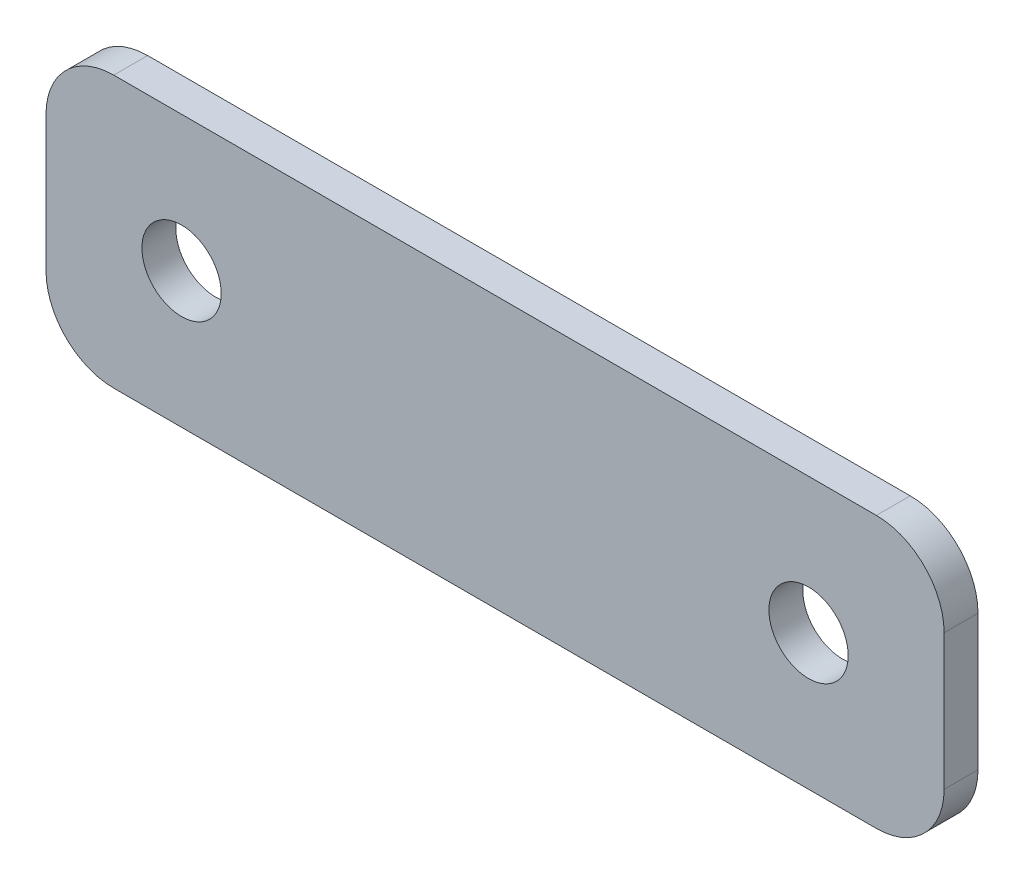
ISO-10303-21;
HEADER;
FILE_DESCRIPTION(('STEP AP214'),'2;1');
FILE_NAME('part.step','',(''),(''),'','','');
FILE_SCHEMA(('AUTOMOTIVE_DESIGN { 1 0 10303 214 1 1 1 1 }'));
ENDSEC;
DATA;
#1=APPLICATION_CONTEXT('core data for automotive mechanical design processes');
#2=APPLICATION_PROTOCOL_DEFINITION('international standard','automotive_design',2000,#1);
#3=PRODUCT_CONTEXT('',#1,'mechanical');
#4=PRODUCT('Part','Part','',(#3));
#5=PRODUCT_RELATED_PRODUCT_CATEGORY('part','',(#4));
#6=PRODUCT_DEFINITION_FORMATION('','',#4);
#7=PRODUCT_DEFINITION_CONTEXT('part definition',#1,'design');
#8=PRODUCT_DEFINITION('design','',#6,#7);
#9=PRODUCT_DEFINITION_SHAPE('','',#8);
#10=(LENGTH_UNIT() NAMED_UNIT(*) SI_UNIT(.MILLI.,.METRE.));
#11=(NAMED_UNIT(*) PLANE_ANGLE_UNIT() SI_UNIT($,.RADIAN.));
#12=(NAMED_UNIT(*) SI_UNIT($,.STERADIAN.) SOLID_ANGLE_UNIT());
#13=UNCERTAINTY_MEASURE_WITH_UNIT(LENGTH_MEASURE(1.E-05),#10,'distance_accuracy_value','');
#14=(GEOMETRIC_REPRESENTATION_CONTEXT(3) GLOBAL_UNCERTAINTY_ASSIGNED_CONTEXT((#13)) GLOBAL_UNIT_ASSIGNED_CONTEXT((#10,
#11,#12)) REPRESENTATION_CONTEXT('',''));
#15=CARTESIAN_POINT('',(0.,0.,0.));
#16=DIRECTION('',(0.,0.,1.));
#17=DIRECTION('',(1.,0.,0.));
#18=AXIS2_PLACEMENT_3D('',#15,#16,#17);
#19=CARTESIAN_POINT('',(5.08,5.08,2.54));
#20=DIRECTION('',(0.,0.,1.));
#21=DIRECTION('',(1.,0.,0.));
#22=AXIS2_PLACEMENT_3D('',#19,#20,#21);
#23=PLANE('',#22);
#24=CARTESIAN_POINT('',(0.,0.,2.54));
#25=DIRECTION('',(0.,0.,1.));
#26=DIRECTION('',(1.,0.,0.));
#27=AXIS2_PLACEMENT_3D('',#24,#25,#26);
#28=CIRCLE('',#27,2.9718);
#29=CARTESIAN_POINT('',(2.9718,0.,2.54));
#30=VERTEX_POINT('',#29);
#31=EDGE_CURVE('E152',#30,#30,#28,.T.);
#32=ORIENTED_EDGE('',*,*,#31,.F.);
#33=EDGE_LOOP('',(#32));
#34=FACE_BOUND('',#33,.T.);
#35=CARTESIAN_POINT('',(5.08,5.08,2.54));
#36=DIRECTION('',(0.,0.,1.));
#37=DIRECTION('',(1.,0.,0.));
#38=AXIS2_PLACEMENT_3D('',#35,#36,#37);
#39=CIRCLE('',#38,5.08);
#40=CARTESIAN_POINT('',(10.16,5.07999999999996,2.54));
#41=VERTEX_POINT('',#40);
#42=CARTESIAN_POINT('',(5.07999999999996,10.16,2.54));
#43=VERTEX_POINT('',#42);
#44=EDGE_CURVE('E172',#41,#43,#39,.T.);
#45=ORIENTED_EDGE('',*,*,#44,.T.);
#46=DIRECTION('',(-1.,0.,0.));
#47=VECTOR('',#46,1.);
#48=CARTESIAN_POINT('',(0.,10.16,2.54));
#49=LINE('',#48,#47);
#50=CARTESIAN_POINT('',(-52.07,10.16,2.54));
#51=VERTEX_POINT('',#50);
#52=EDGE_CURVE('E104',#43,#51,#49,.T.);
#53=ORIENTED_EDGE('',*,*,#52,.T.);
#54=CARTESIAN_POINT('',(-52.07,5.08,2.54));
#55=DIRECTION('',(0.,0.,1.));
#56=DIRECTION('',(-1.,0.,0.));
#57=AXIS2_PLACEMENT_3D('',#54,#55,#56);
#58=CIRCLE('',#57,5.08);
#59=CARTESIAN_POINT('',(-57.15,5.07999999999996,2.54));
#60=VERTEX_POINT('',#59);
#61=EDGE_CURVE('E193',#51,#60,#58,.T.);
#62=ORIENTED_EDGE('',*,*,#61,.T.);
#63=DIRECTION('',(0.,-1.,0.));
#64=VECTOR('',#63,1.);
#65=CARTESIAN_POINT('',(-57.15,5.07999999999996,2.54));
#66=LINE('',#65,#64);
#67=CARTESIAN_POINT('',(-57.15,-5.08000000000001,2.54));
#68=VERTEX_POINT('',#67);
#69=EDGE_CURVE('E205',#60,#68,#66,.T.);
#70=ORIENTED_EDGE('',*,*,#69,.T.);
#71=CARTESIAN_POINT('',(-52.07,-5.08000000000001,2.54));
#72=DIRECTION('',(0.,0.,1.));
#73=DIRECTION('',(-1.,0.,0.));
#74=AXIS2_PLACEMENT_3D('',#71,#72,#73);
#75=CIRCLE('',#74,5.08);
#76=CARTESIAN_POINT('',(-52.07,-10.16,2.54));
#77=VERTEX_POINT('',#76);
#78=EDGE_CURVE('E124',#68,#77,#75,.T.);
#79=ORIENTED_EDGE('',*,*,#78,.T.);
#80=DIRECTION('',(1.,0.,0.));
#81=VECTOR('',#80,1.);
#82=CARTESIAN_POINT('',(-52.07,-10.16,2.54));
#83=LINE('',#82,#81);
#84=CARTESIAN_POINT('',(5.07999999999997,-10.16,2.54));
#85=VERTEX_POINT('',#84);
#86=EDGE_CURVE('E117',#77,#85,#83,.T.);
#87=ORIENTED_EDGE('',*,*,#86,.T.);
#88=CARTESIAN_POINT('',(5.08,-5.08000000000001,2.54));
#89=DIRECTION('',(0.,0.,1.));
#90=DIRECTION('',(-1.,0.,0.));
#91=AXIS2_PLACEMENT_3D('',#88,#89,#90);
#92=CIRCLE('',#91,5.08);
#93=CARTESIAN_POINT('',(10.16,-5.07999999999997,2.54));
#94=VERTEX_POINT('',#93);
#95=EDGE_CURVE('E121',#85,#94,#92,.T.);
#96=ORIENTED_EDGE('',*,*,#95,.T.);
#97=DIRECTION('',(0.,1.,0.));
#98=VECTOR('',#97,1.);
#99=CARTESIAN_POINT('',(10.16,0.,2.54));
#100=LINE('',#99,#98);
#101=EDGE_CURVE('E63',#94,#41,#100,.T.);
#102=ORIENTED_EDGE('',*,*,#101,.T.);
#103=EDGE_LOOP('',(#45,#53,#62,#70,#79,#87,#96,#102));
#104=FACE_BOUND('',#103,.T.);
#105=CARTESIAN_POINT('',(-46.99,0.,2.54));
#106=DIRECTION('',(0.,0.,1.));
#107=DIRECTION('',(1.,0.,0.));
#108=AXIS2_PLACEMENT_3D('',#105,#106,#107);
#109=CIRCLE('',#108,2.9718);
#110=CARTESIAN_POINT('',(-44.0182,0.,2.54));
#111=VERTEX_POINT('',#110);
#112=EDGE_CURVE('E219',#111,#111,#109,.T.);
#113=ORIENTED_EDGE('',*,*,#112,.F.);
#114=EDGE_LOOP('',(#113));
#115=FACE_BOUND('',#114,.T.);
#116=ADVANCED_FACE('F45',(#34,#104,#115),#23,.T.);
#117=CARTESIAN_POINT('',(5.08,5.08,0.));
#118=DIRECTION('',(0.,0.,1.));
#119=DIRECTION('',(1.,0.,0.));
#120=AXIS2_PLACEMENT_3D('',#117,#118,#119);
#121=PLANE('',#120);
#122=CARTESIAN_POINT('',(5.08,5.08,0.));
#123=DIRECTION('',(0.,0.,1.));
#124=DIRECTION('',(1.,0.,0.));
#125=AXIS2_PLACEMENT_3D('',#122,#123,#124);
#126=CIRCLE('',#125,5.08);
#127=CARTESIAN_POINT('',(10.16,5.07999999999996,0.));
#128=VERTEX_POINT('',#127);
#129=CARTESIAN_POINT('',(5.07999999999996,10.16,0.));
#130=VERTEX_POINT('',#129);
#131=EDGE_CURVE('E147',#128,#130,#126,.T.);
#132=ORIENTED_EDGE('',*,*,#131,.F.);
#133=DIRECTION('',(0.,1.,0.));
#134=VECTOR('',#133,1.);
#135=CARTESIAN_POINT('',(10.16,0.,0.));
#136=LINE('',#135,#134);
#137=CARTESIAN_POINT('',(10.16,-5.07999999999997,0.));
#138=VERTEX_POINT('',#137);
#139=EDGE_CURVE('E92',#138,#128,#136,.T.);
#140=ORIENTED_EDGE('',*,*,#139,.F.);
#141=CARTESIAN_POINT('',(5.08,-5.08000000000001,0.));
#142=DIRECTION('',(0.,0.,1.));
#143=DIRECTION('',(-1.,0.,0.));
#144=AXIS2_PLACEMENT_3D('',#141,#142,#143);
#145=CIRCLE('',#144,5.08);
#146=CARTESIAN_POINT('',(5.07999999999997,-10.16,0.));
#147=VERTEX_POINT('',#146);
#148=EDGE_CURVE('E167',#147,#138,#145,.T.);
#149=ORIENTED_EDGE('',*,*,#148,.F.);
#150=DIRECTION('',(1.,0.,0.));
#151=VECTOR('',#150,1.);
#152=CARTESIAN_POINT('',(-46.99,-10.16,0.));
#153=LINE('',#152,#151);
#154=CARTESIAN_POINT('',(-52.07,-10.16,0.));
#155=VERTEX_POINT('',#154);
#156=EDGE_CURVE('E133',#155,#147,#153,.T.);
#157=ORIENTED_EDGE('',*,*,#156,.F.);
#158=CARTESIAN_POINT('',(-52.07,-5.08000000000001,0.));
#159=DIRECTION('',(0.,0.,1.));
#160=DIRECTION('',(-1.,0.,0.));
#161=AXIS2_PLACEMENT_3D('',#158,#159,#160);
#162=CIRCLE('',#161,5.08);
#163=CARTESIAN_POINT('',(-57.15,-5.08000000000001,0.));
#164=VERTEX_POINT('',#163);
#165=EDGE_CURVE('E161',#164,#155,#162,.T.);
#166=ORIENTED_EDGE('',*,*,#165,.F.);
#167=DIRECTION('',(0.,-1.,0.));
#168=VECTOR('',#167,1.);
#169=CARTESIAN_POINT('',(-57.15,5.07999999999996,0.));
#170=LINE('',#169,#168);
#171=CARTESIAN_POINT('',(-57.15,5.07999999999996,0.));
#172=VERTEX_POINT('',#171);
#173=EDGE_CURVE('E158',#172,#164,#170,.T.);
#174=ORIENTED_EDGE('',*,*,#173,.F.);
#175=CARTESIAN_POINT('',(-52.07,5.08,0.));
#176=DIRECTION('',(0.,0.,1.));
#177=DIRECTION('',(-1.,0.,0.));
#178=AXIS2_PLACEMENT_3D('',#175,#176,#177);
#179=CIRCLE('',#178,5.08);
#180=CARTESIAN_POINT('',(-52.07,10.16,0.));
#181=VERTEX_POINT('',#180);
#182=EDGE_CURVE('E155',#181,#172,#179,.T.);
#183=ORIENTED_EDGE('',*,*,#182,.F.);
#184=DIRECTION('',(-1.,0.,0.));
#185=VECTOR('',#184,1.);
#186=CARTESIAN_POINT('',(-46.99,10.16,0.));
#187=LINE('',#186,#185);
#188=EDGE_CURVE('E151',#130,#181,#187,.T.);
#189=ORIENTED_EDGE('',*,*,#188,.F.);
#190=EDGE_LOOP('',(#132,#140,#149,#157,#166,#174,#183,#189));
#191=FACE_BOUND('',#190,.T.);
#192=CARTESIAN_POINT('',(0.,0.,0.));
#193=DIRECTION('',(0.,0.,1.));
#194=DIRECTION('',(1.,0.,0.));
#195=AXIS2_PLACEMENT_3D('',#192,#193,#194);
#196=CIRCLE('',#195,2.9718);
#197=CARTESIAN_POINT('',(2.9718,0.,0.));
#198=VERTEX_POINT('',#197);
#199=EDGE_CURVE('E215',#198,#198,#196,.T.);
#200=ORIENTED_EDGE('',*,*,#199,.T.);
#201=EDGE_LOOP('',(#200));
#202=FACE_BOUND('',#201,.T.);
#203=CARTESIAN_POINT('',(-46.99,0.,0.));
#204=DIRECTION('',(0.,0.,1.));
#205=DIRECTION('',(1.,0.,0.));
#206=AXIS2_PLACEMENT_3D('',#203,#204,#205);
#207=CIRCLE('',#206,2.9718);
#208=CARTESIAN_POINT('',(-44.0182,0.,0.));
#209=VERTEX_POINT('',#208);
#210=EDGE_CURVE('E223',#209,#209,#207,.T.);
#211=ORIENTED_EDGE('',*,*,#210,.T.);
#212=EDGE_LOOP('',(#211));
#213=FACE_BOUND('',#212,.T.);
#214=ADVANCED_FACE('F195',(#191,#202,#213),#121,.F.);
#215=CARTESIAN_POINT('',(5.08,5.08,2.54));
#216=DIRECTION('',(0.,0.,-1.));
#217=DIRECTION('',(-1.,0.,0.));
#218=AXIS2_PLACEMENT_3D('',#215,#216,#217);
#219=CYLINDRICAL_SURFACE('',#218,5.08);
#220=ORIENTED_EDGE('',*,*,#131,.T.);
#221=DIRECTION('',(0.,0.,-1.));
#222=VECTOR('',#221,1.);
#223=CARTESIAN_POINT('',(5.07999999999996,10.16,2.54));
#224=LINE('',#223,#222);
#225=EDGE_CURVE('E11',#43,#130,#224,.T.);
#226=ORIENTED_EDGE('',*,*,#225,.F.);
#227=ORIENTED_EDGE('',*,*,#44,.F.);
#228=DIRECTION('',(0.,0.,-1.));
#229=VECTOR('',#228,1.);
#230=CARTESIAN_POINT('',(10.16,5.07999999999996,2.54));
#231=LINE('',#230,#229);
#232=EDGE_CURVE('E143',#41,#128,#231,.T.);
#233=ORIENTED_EDGE('',*,*,#232,.T.);
#234=EDGE_LOOP('',(#220,#226,#227,#233));
#235=FACE_BOUND('',#234,.T.);
#236=ADVANCED_FACE('F47',(#235),#219,.T.);
#237=CARTESIAN_POINT('',(-46.99,10.16,2.54));
#238=DIRECTION('',(0.,-1.,0.));
#239=DIRECTION('',(0.,0.,-1.));
#240=AXIS2_PLACEMENT_3D('',#237,#238,#239);
#241=PLANE('',#240);
#242=ORIENTED_EDGE('',*,*,#188,.T.);
#243=DIRECTION('',(0.,0.,-1.));
#244=VECTOR('',#243,1.);
#245=CARTESIAN_POINT('',(-52.07,10.16,2.54));
#246=LINE('',#245,#244);
#247=EDGE_CURVE('E55',#51,#181,#246,.T.);
#248=ORIENTED_EDGE('',*,*,#247,.F.);
#249=ORIENTED_EDGE('',*,*,#52,.F.);
#250=ORIENTED_EDGE('',*,*,#225,.T.);
#251=EDGE_LOOP('',(#242,#248,#249,#250));
#252=FACE_BOUND('',#251,.T.);
#253=ADVANCED_FACE('F257',(#252),#241,.F.);
#254=CARTESIAN_POINT('',(-52.07,5.08,2.54));
#255=DIRECTION('',(0.,0.,-1.));
#256=DIRECTION('',(-1.,0.,0.));
#257=AXIS2_PLACEMENT_3D('',#254,#255,#256);
#258=CYLINDRICAL_SURFACE('',#257,5.08);
#259=ORIENTED_EDGE('',*,*,#182,.T.);
#260=DIRECTION('',(0.,0.,-1.));
#261=VECTOR('',#260,1.);
#262=CARTESIAN_POINT('',(-57.15,5.07999999999996,2.54));
#263=LINE('',#262,#261);
#264=EDGE_CURVE('E183',#60,#172,#263,.T.);
#265=ORIENTED_EDGE('',*,*,#264,.F.);
#266=ORIENTED_EDGE('',*,*,#61,.F.);
#267=ORIENTED_EDGE('',*,*,#247,.T.);
#268=EDGE_LOOP('',(#259,#265,#266,#267));
#269=FACE_BOUND('',#268,.T.);
#270=ADVANCED_FACE('F191',(#269),#258,.T.);
#271=CARTESIAN_POINT('',(-57.15,5.07999999999996,2.54));
#272=DIRECTION('',(1.,0.,0.));
#273=DIRECTION('',(0.,0.,-1.));
#274=AXIS2_PLACEMENT_3D('',#271,#272,#273);
#275=PLANE('',#274);
#276=ORIENTED_EDGE('',*,*,#173,.T.);
#277=DIRECTION('',(0.,0.,-1.));
#278=VECTOR('',#277,1.);
#279=CARTESIAN_POINT('',(-57.15,-5.08000000000001,2.54));
#280=LINE('',#279,#278);
#281=EDGE_CURVE('E179',#68,#164,#280,.T.);
#282=ORIENTED_EDGE('',*,*,#281,.F.);
#283=ORIENTED_EDGE('',*,*,#69,.F.);
#284=ORIENTED_EDGE('',*,*,#264,.T.);
#285=EDGE_LOOP('',(#276,#282,#283,#284));
#286=FACE_BOUND('',#285,.T.);
#287=ADVANCED_FACE('F200',(#286),#275,.F.);
#288=CARTESIAN_POINT('',(-52.07,-5.08000000000001,2.54));
#289=DIRECTION('',(0.,0.,-1.));
#290=DIRECTION('',(-1.,0.,0.));
#291=AXIS2_PLACEMENT_3D('',#288,#289,#290);
#292=CYLINDRICAL_SURFACE('',#291,5.08);
#293=ORIENTED_EDGE('',*,*,#165,.T.);
#294=DIRECTION('',(0.,0.,-1.));
#295=VECTOR('',#294,1.);
#296=CARTESIAN_POINT('',(-52.07,-10.16,2.54));
#297=LINE('',#296,#295);
#298=EDGE_CURVE('E136',#77,#155,#297,.T.);
#299=ORIENTED_EDGE('',*,*,#298,.F.);
#300=ORIENTED_EDGE('',*,*,#78,.F.);
#301=ORIENTED_EDGE('',*,*,#281,.T.);
#302=EDGE_LOOP('',(#293,#299,#300,#301));
#303=FACE_BOUND('',#302,.T.);
#304=ADVANCED_FACE('F203',(#303),#292,.T.);
#305=CARTESIAN_POINT('',(-46.99,-10.16,2.54));
#306=DIRECTION('',(0.,1.,0.));
#307=DIRECTION('',(0.,0.,1.));
#308=AXIS2_PLACEMENT_3D('',#305,#306,#307);
#309=PLANE('',#308);
#310=ORIENTED_EDGE('',*,*,#156,.T.);
#311=DIRECTION('',(0.,0.,-1.));
#312=VECTOR('',#311,1.);
#313=CARTESIAN_POINT('',(5.07999999999997,-10.16,2.54));
#314=LINE('',#313,#312);
#315=EDGE_CURVE('E131',#85,#147,#314,.T.);
#316=ORIENTED_EDGE('',*,*,#315,.F.);
#317=ORIENTED_EDGE('',*,*,#86,.F.);
#318=ORIENTED_EDGE('',*,*,#298,.T.);
#319=EDGE_LOOP('',(#310,#316,#317,#318));
#320=FACE_BOUND('',#319,.T.);
#321=ADVANCED_FACE('F132',(#320),#309,.F.);
#322=CARTESIAN_POINT('',(5.08,-5.08000000000001,2.54));
#323=DIRECTION('',(0.,0.,-1.));
#324=DIRECTION('',(-1.,0.,0.));
#325=AXIS2_PLACEMENT_3D('',#322,#323,#324);
#326=CYLINDRICAL_SURFACE('',#325,5.08);
#327=ORIENTED_EDGE('',*,*,#148,.T.);
#328=DIRECTION('',(0.,0.,-1.));
#329=VECTOR('',#328,1.);
#330=CARTESIAN_POINT('',(10.16,-5.07999999999997,2.54));
#331=LINE('',#330,#329);
#332=EDGE_CURVE('E137',#94,#138,#331,.T.);
#333=ORIENTED_EDGE('',*,*,#332,.F.);
#334=ORIENTED_EDGE('',*,*,#95,.F.);
#335=ORIENTED_EDGE('',*,*,#315,.T.);
#336=EDGE_LOOP('',(#327,#333,#334,#335));
#337=FACE_BOUND('',#336,.T.);
#338=ADVANCED_FACE('F139',(#337),#326,.T.);
#339=CARTESIAN_POINT('',(10.16,0.,2.54));
#340=DIRECTION('',(-1.,0.,0.));
#341=DIRECTION('',(0.,0.,1.));
#342=AXIS2_PLACEMENT_3D('',#339,#340,#341);
#343=PLANE('',#342);
#344=ORIENTED_EDGE('',*,*,#139,.T.);
#345=ORIENTED_EDGE('',*,*,#232,.F.);
#346=ORIENTED_EDGE('',*,*,#101,.F.);
#347=ORIENTED_EDGE('',*,*,#332,.T.);
#348=EDGE_LOOP('',(#344,#345,#346,#347));
#349=FACE_BOUND('',#348,.T.);
#350=ADVANCED_FACE('F245',(#349),#343,.F.);
#351=CARTESIAN_POINT('',(0.,0.,2.54));
#352=DIRECTION('',(0.,0.,-1.));
#353=DIRECTION('',(-1.,0.,0.));
#354=AXIS2_PLACEMENT_3D('',#351,#352,#353);
#355=CYLINDRICAL_SURFACE('',#354,2.9718);
#356=ORIENTED_EDGE('',*,*,#31,.T.);
#357=EDGE_LOOP('',(#356));
#358=FACE_BOUND('',#357,.T.);
#359=ORIENTED_EDGE('',*,*,#199,.F.);
#360=EDGE_LOOP('',(#359));
#361=FACE_BOUND('',#360,.T.);
#362=ADVANCED_FACE('F242',(#358,#361),#355,.F.);
#363=CARTESIAN_POINT('',(-46.99,0.,2.54));
#364=DIRECTION('',(0.,0.,-1.));
#365=DIRECTION('',(-1.,0.,0.));
#366=AXIS2_PLACEMENT_3D('',#363,#364,#365);
#367=CYLINDRICAL_SURFACE('',#366,2.9718);
#368=ORIENTED_EDGE('',*,*,#112,.T.);
#369=EDGE_LOOP('',(#368));
#370=FACE_BOUND('',#369,.T.);
#371=ORIENTED_EDGE('',*,*,#210,.F.);
#372=EDGE_LOOP('',(#371));
#373=FACE_BOUND('',#372,.T.);
#374=ADVANCED_FACE('F231',(#370,#373),#367,.F.);
#375=CLOSED_SHELL('',(#116,#214,#236,#253,#270,#287,#304,#321,#338,#350,#362,#374));
#376=MANIFOLD_SOLID_BREP('B2',#375);
#377=ADVANCED_BREP_SHAPE_REPRESENTATION('',(#18,#376),#14);
#378=SHAPE_DEFINITION_REPRESENTATION(#9,#377);
ENDSEC;
END-ISO-10303-21;
